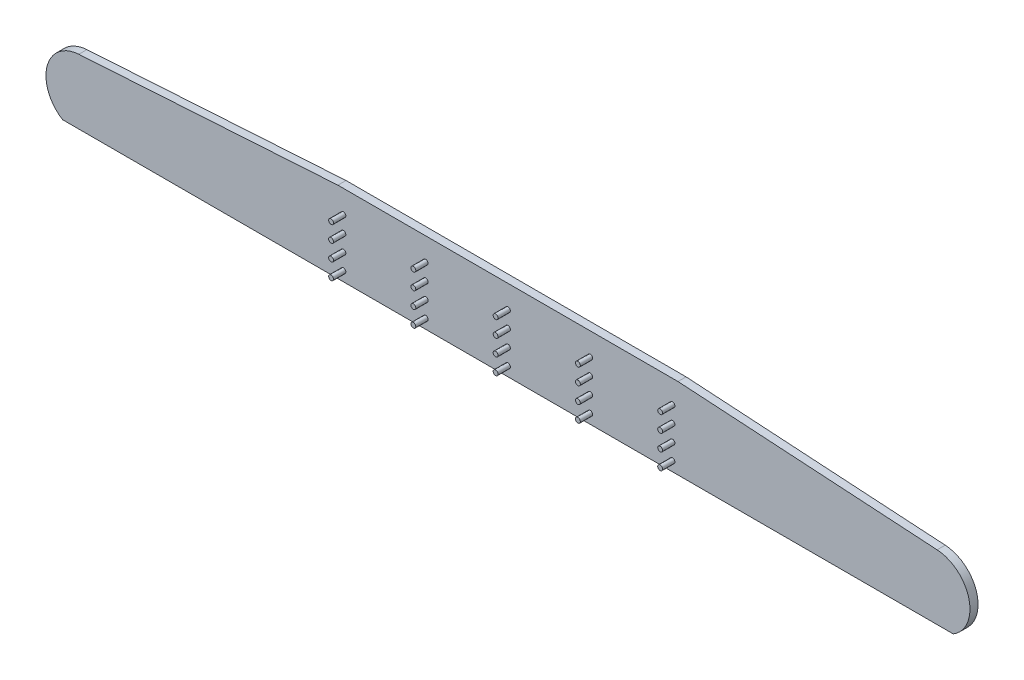
ISO-10303-21;
HEADER;
FILE_DESCRIPTION(('STEP AP214'),'2;1');
FILE_NAME('part.step','',(''),(''),'','','');
FILE_SCHEMA(('AUTOMOTIVE_DESIGN { 1 0 10303 214 1 1 1 1 }'));
ENDSEC;
DATA;
#1=APPLICATION_CONTEXT('core data for automotive mechanical design processes');
#2=APPLICATION_PROTOCOL_DEFINITION('international standard','automotive_design',2000,#1);
#3=PRODUCT_CONTEXT('',#1,'mechanical');
#4=PRODUCT('Part','Part','',(#3));
#5=PRODUCT_RELATED_PRODUCT_CATEGORY('part','',(#4));
#6=PRODUCT_DEFINITION_FORMATION('','',#4);
#7=PRODUCT_DEFINITION_CONTEXT('part definition',#1,'design');
#8=PRODUCT_DEFINITION('design','',#6,#7);
#9=PRODUCT_DEFINITION_SHAPE('','',#8);
#10=(LENGTH_UNIT() NAMED_UNIT(*) SI_UNIT(.MILLI.,.METRE.));
#11=(NAMED_UNIT(*) PLANE_ANGLE_UNIT() SI_UNIT($,.RADIAN.));
#12=(NAMED_UNIT(*) SI_UNIT($,.STERADIAN.) SOLID_ANGLE_UNIT());
#13=UNCERTAINTY_MEASURE_WITH_UNIT(LENGTH_MEASURE(1.E-05),#10,'distance_accuracy_value','');
#14=(GEOMETRIC_REPRESENTATION_CONTEXT(3) GLOBAL_UNCERTAINTY_ASSIGNED_CONTEXT((#13)) GLOBAL_UNIT_ASSIGNED_CONTEXT((#10,
#11,#12)) REPRESENTATION_CONTEXT('',''));
#15=CARTESIAN_POINT('',(0.,0.,0.));
#16=DIRECTION('',(0.,0.,1.));
#17=DIRECTION('',(1.,0.,0.));
#18=AXIS2_PLACEMENT_3D('',#15,#16,#17);
#19=CARTESIAN_POINT('',(0.,-25.,5.));
#20=DIRECTION('',(0.,-1.,0.));
#21=DIRECTION('',(0.,0.,-1.));
#22=AXIS2_PLACEMENT_3D('',#19,#20,#21);
#23=PLANE('',#22);
#24=DIRECTION('',(-1.,0.,0.));
#25=VECTOR('',#24,1.);
#26=CARTESIAN_POINT('',(0.,-25.,0.));
#27=LINE('',#26,#25);
#28=CARTESIAN_POINT('',(275.,-25.,0.));
#29=VERTEX_POINT('',#28);
#30=CARTESIAN_POINT('',(-275.,-25.,0.));
#31=VERTEX_POINT('',#30);
#32=EDGE_CURVE('E121',#29,#31,#27,.T.);
#33=ORIENTED_EDGE('',*,*,#32,.F.);
#34=DIRECTION('',(0.,0.,-1.));
#35=VECTOR('',#34,1.);
#36=CARTESIAN_POINT('',(275.,-25.,5.));
#37=LINE('',#36,#35);
#38=CARTESIAN_POINT('',(275.,-25.,5.));
#39=VERTEX_POINT('',#38);
#40=EDGE_CURVE('E11',#39,#29,#37,.T.);
#41=ORIENTED_EDGE('',*,*,#40,.F.);
#42=DIRECTION('',(-1.,0.,0.));
#43=VECTOR('',#42,1.);
#44=CARTESIAN_POINT('',(0.,-25.,5.));
#45=LINE('',#44,#43);
#46=CARTESIAN_POINT('',(-275.,-25.,5.));
#47=VERTEX_POINT('',#46);
#48=EDGE_CURVE('E135',#39,#47,#45,.T.);
#49=ORIENTED_EDGE('',*,*,#48,.T.);
#50=DIRECTION('',(0.,0.,-1.));
#51=VECTOR('',#50,1.);
#52=CARTESIAN_POINT('',(-275.,-25.,5.));
#53=LINE('',#52,#51);
#54=EDGE_CURVE('E83',#47,#31,#53,.T.);
#55=ORIENTED_EDGE('',*,*,#54,.T.);
#56=EDGE_LOOP('',(#33,#41,#49,#55));
#57=FACE_BOUND('',#56,.T.);
#58=ADVANCED_FACE('F39',(#57),#23,.T.);
#59=CARTESIAN_POINT('',(263.650793650794,-6.58730158730157,5.));
#60=DIRECTION('',(0.,0.,-1.));
#61=DIRECTION('',(-1.,0.,0.));
#62=AXIS2_PLACEMENT_3D('',#59,#60,#61);
#63=CYLINDRICAL_SURFACE('',#62,21.6294231914273);
#64=CARTESIAN_POINT('',(263.650793650794,-6.58730158730157,0.));
#65=DIRECTION('',(0.,0.,1.));
#66=DIRECTION('',(1.,0.,0.));
#67=AXIS2_PLACEMENT_3D('',#64,#65,#66);
#68=CIRCLE('',#67,21.6294231914273);
#69=CARTESIAN_POINT('',(265.,15.,0.));
#70=VERTEX_POINT('',#69);
#71=EDGE_CURVE('E124',#70,#29,#68,.F.);
#72=ORIENTED_EDGE('',*,*,#71,.F.);
#73=DIRECTION('',(0.,0.,-1.));
#74=VECTOR('',#73,1.);
#75=CARTESIAN_POINT('',(265.,15.,5.));
#76=LINE('',#75,#74);
#77=CARTESIAN_POINT('',(265.,15.,5.));
#78=VERTEX_POINT('',#77);
#79=EDGE_CURVE('E47',#78,#70,#76,.T.);
#80=ORIENTED_EDGE('',*,*,#79,.F.);
#81=CARTESIAN_POINT('',(263.650793650794,-6.58730158730157,5.));
#82=DIRECTION('',(0.,0.,1.));
#83=DIRECTION('',(1.,0.,0.));
#84=AXIS2_PLACEMENT_3D('',#81,#82,#83);
#85=CIRCLE('',#84,21.6294231914273);
#86=EDGE_CURVE('E116',#78,#39,#85,.F.);
#87=ORIENTED_EDGE('',*,*,#86,.T.);
#88=ORIENTED_EDGE('',*,*,#40,.T.);
#89=EDGE_LOOP('',(#72,#80,#87,#88));
#90=FACE_BOUND('',#89,.T.);
#91=ADVANCED_FACE('F144',(#90),#63,.T.);
#92=CARTESIAN_POINT('',(1.96498054474708,31.4396887159533,5.));
#93=DIRECTION('',(0.0623782861551805,0.998052578482888,0.));
#94=DIRECTION('',(-0.998052578482889,0.0623782861551805,0.));
#95=AXIS2_PLACEMENT_3D('',#92,#93,#94);
#96=PLANE('',#95);
#97=DIRECTION('',(0.998052578482889,-0.0623782861551805,0.));
#98=VECTOR('',#97,1.);
#99=CARTESIAN_POINT('',(1.96498054474708,31.4396887159533,0.));
#100=LINE('',#99,#98);
#101=CARTESIAN_POINT('',(105.,25.,0.));
#102=VERTEX_POINT('',#101);
#103=EDGE_CURVE('E128',#102,#70,#100,.T.);
#104=ORIENTED_EDGE('',*,*,#103,.F.);
#105=DIRECTION('',(0.,0.,-1.));
#106=VECTOR('',#105,1.);
#107=CARTESIAN_POINT('',(105.,25.,5.));
#108=LINE('',#107,#106);
#109=CARTESIAN_POINT('',(105.,25.,5.));
#110=VERTEX_POINT('',#109);
#111=EDGE_CURVE('E104',#110,#102,#108,.T.);
#112=ORIENTED_EDGE('',*,*,#111,.F.);
#113=DIRECTION('',(0.998052578482889,-0.0623782861551805,0.));
#114=VECTOR('',#113,1.);
#115=CARTESIAN_POINT('',(1.96498054474708,31.4396887159533,5.));
#116=LINE('',#115,#114);
#117=EDGE_CURVE('E114',#110,#78,#116,.T.);
#118=ORIENTED_EDGE('',*,*,#117,.T.);
#119=ORIENTED_EDGE('',*,*,#79,.T.);
#120=EDGE_LOOP('',(#104,#112,#118,#119));
#121=FACE_BOUND('',#120,.T.);
#122=ADVANCED_FACE('F141',(#121),#96,.T.);
#123=CARTESIAN_POINT('',(0.,25.,5.));
#124=DIRECTION('',(0.,1.,0.));
#125=DIRECTION('',(-1.,0.,0.));
#126=AXIS2_PLACEMENT_3D('',#123,#124,#125);
#127=PLANE('',#126);
#128=DIRECTION('',(1.,0.,0.));
#129=VECTOR('',#128,1.);
#130=CARTESIAN_POINT('',(0.,25.,0.));
#131=LINE('',#130,#129);
#132=CARTESIAN_POINT('',(-105.,25.,0.));
#133=VERTEX_POINT('',#132);
#134=EDGE_CURVE('E103',#133,#102,#131,.T.);
#135=ORIENTED_EDGE('',*,*,#134,.F.);
#136=DIRECTION('',(0.,0.,-1.));
#137=VECTOR('',#136,1.);
#138=CARTESIAN_POINT('',(-105.,25.,5.));
#139=LINE('',#138,#137);
#140=CARTESIAN_POINT('',(-105.,25.,5.));
#141=VERTEX_POINT('',#140);
#142=EDGE_CURVE('E97',#141,#133,#139,.T.);
#143=ORIENTED_EDGE('',*,*,#142,.F.);
#144=DIRECTION('',(1.,0.,0.));
#145=VECTOR('',#144,1.);
#146=CARTESIAN_POINT('',(0.,25.,5.));
#147=LINE('',#146,#145);
#148=EDGE_CURVE('E101',#141,#110,#147,.T.);
#149=ORIENTED_EDGE('',*,*,#148,.T.);
#150=ORIENTED_EDGE('',*,*,#111,.T.);
#151=EDGE_LOOP('',(#135,#143,#149,#150));
#152=FACE_BOUND('',#151,.T.);
#153=ADVANCED_FACE('F99',(#152),#127,.T.);
#154=CARTESIAN_POINT('',(-1.96498054474708,31.4396887159533,5.));
#155=DIRECTION('',(0.0623782861551805,-0.998052578482888,0.));
#156=DIRECTION('',(0.998052578482889,0.0623782861551805,0.));
#157=AXIS2_PLACEMENT_3D('',#154,#155,#156);
#158=PLANE('',#157);
#159=DIRECTION('',(-0.998052578482889,-0.0623782861551805,0.));
#160=VECTOR('',#159,1.);
#161=CARTESIAN_POINT('',(-1.96498054474708,31.4396887159533,0.));
#162=LINE('',#161,#160);
#163=CARTESIAN_POINT('',(-265.,15.,0.));
#164=VERTEX_POINT('',#163);
#165=EDGE_CURVE('E76',#133,#164,#162,.T.);
#166=ORIENTED_EDGE('',*,*,#165,.T.);
#167=DIRECTION('',(0.,0.,-1.));
#168=VECTOR('',#167,1.);
#169=CARTESIAN_POINT('',(-265.,15.,5.));
#170=LINE('',#169,#168);
#171=CARTESIAN_POINT('',(-265.,15.,5.));
#172=VERTEX_POINT('',#171);
#173=EDGE_CURVE('E105',#172,#164,#170,.T.);
#174=ORIENTED_EDGE('',*,*,#173,.F.);
#175=DIRECTION('',(-0.998052578482889,-0.0623782861551805,0.));
#176=VECTOR('',#175,1.);
#177=CARTESIAN_POINT('',(-1.96498054474708,31.4396887159533,5.));
#178=LINE('',#177,#176);
#179=EDGE_CURVE('E107',#141,#172,#178,.T.);
#180=ORIENTED_EDGE('',*,*,#179,.F.);
#181=ORIENTED_EDGE('',*,*,#142,.T.);
#182=EDGE_LOOP('',(#166,#174,#180,#181));
#183=FACE_BOUND('',#182,.T.);
#184=ADVANCED_FACE('F108',(#183),#158,.F.);
#185=CARTESIAN_POINT('',(-263.650793650794,-6.58730158730157,5.));
#186=DIRECTION('',(0.,0.,-1.));
#187=DIRECTION('',(-1.,0.,0.));
#188=AXIS2_PLACEMENT_3D('',#185,#186,#187);
#189=CYLINDRICAL_SURFACE('',#188,21.6294231914273);
#190=CARTESIAN_POINT('',(-263.650793650794,-6.58730158730157,0.));
#191=DIRECTION('',(0.,0.,1.));
#192=DIRECTION('',(1.,0.,0.));
#193=AXIS2_PLACEMENT_3D('',#190,#191,#192);
#194=CIRCLE('',#193,21.6294231914273);
#195=EDGE_CURVE('E133',#164,#31,#194,.T.);
#196=ORIENTED_EDGE('',*,*,#195,.T.);
#197=ORIENTED_EDGE('',*,*,#54,.F.);
#198=CARTESIAN_POINT('',(-263.650793650794,-6.58730158730157,5.));
#199=DIRECTION('',(0.,0.,1.));
#200=DIRECTION('',(1.,0.,0.));
#201=AXIS2_PLACEMENT_3D('',#198,#199,#200);
#202=CIRCLE('',#201,21.6294231914273);
#203=EDGE_CURVE('E55',#172,#47,#202,.T.);
#204=ORIENTED_EDGE('',*,*,#203,.F.);
#205=ORIENTED_EDGE('',*,*,#173,.T.);
#206=EDGE_LOOP('',(#196,#197,#204,#205));
#207=FACE_BOUND('',#206,.T.);
#208=ADVANCED_FACE('F149',(#207),#189,.T.);
#209=CARTESIAN_POINT('',(0.,0.,5.));
#210=DIRECTION('',(0.,0.,1.));
#211=DIRECTION('',(1.,0.,0.));
#212=AXIS2_PLACEMENT_3D('',#209,#210,#211);
#213=PLANE('',#212);
#214=CARTESIAN_POINT('',(101.6,-19.,5.));
#215=DIRECTION('',(0.,0.,1.));
#216=DIRECTION('',(1.,0.,0.));
#217=AXIS2_PLACEMENT_3D('',#214,#215,#216);
#218=CIRCLE('',#217,1.5);
#219=CARTESIAN_POINT('',(103.1,-19.,5.));
#220=VERTEX_POINT('',#219);
#221=EDGE_CURVE('E263',#220,#220,#218,.T.);
#222=ORIENTED_EDGE('',*,*,#221,.F.);
#223=EDGE_LOOP('',(#222));
#224=FACE_BOUND('',#223,.T.);
#225=CARTESIAN_POINT('',(101.6,-9.,5.));
#226=DIRECTION('',(0.,0.,1.));
#227=DIRECTION('',(1.,0.,0.));
#228=AXIS2_PLACEMENT_3D('',#225,#226,#227);
#229=CIRCLE('',#228,1.5);
#230=CARTESIAN_POINT('',(103.1,-9.,5.));
#231=VERTEX_POINT('',#230);
#232=EDGE_CURVE('E257',#231,#231,#229,.T.);
#233=ORIENTED_EDGE('',*,*,#232,.F.);
#234=EDGE_LOOP('',(#233));
#235=FACE_BOUND('',#234,.T.);
#236=CARTESIAN_POINT('',(101.6,0.999999999999999,5.));
#237=DIRECTION('',(0.,0.,1.));
#238=DIRECTION('',(1.,0.,0.));
#239=AXIS2_PLACEMENT_3D('',#236,#237,#238);
#240=CIRCLE('',#239,1.5);
#241=CARTESIAN_POINT('',(103.1,0.999999999999999,5.));
#242=VERTEX_POINT('',#241);
#243=EDGE_CURVE('E251',#242,#242,#240,.T.);
#244=ORIENTED_EDGE('',*,*,#243,.F.);
#245=EDGE_LOOP('',(#244));
#246=FACE_BOUND('',#245,.T.);
#247=CARTESIAN_POINT('',(101.6,11.,5.));
#248=DIRECTION('',(0.,0.,1.));
#249=DIRECTION('',(1.,0.,0.));
#250=AXIS2_PLACEMENT_3D('',#247,#248,#249);
#251=CIRCLE('',#250,1.5);
#252=CARTESIAN_POINT('',(103.1,11.,5.));
#253=VERTEX_POINT('',#252);
#254=EDGE_CURVE('E245',#253,#253,#251,.T.);
#255=ORIENTED_EDGE('',*,*,#254,.F.);
#256=EDGE_LOOP('',(#255));
#257=FACE_BOUND('',#256,.T.);
#258=CARTESIAN_POINT('',(50.8,11.,5.));
#259=DIRECTION('',(0.,0.,1.));
#260=DIRECTION('',(1.,0.,0.));
#261=AXIS2_PLACEMENT_3D('',#258,#259,#260);
#262=CIRCLE('',#261,1.5);
#263=CARTESIAN_POINT('',(52.3,11.,5.));
#264=VERTEX_POINT('',#263);
#265=EDGE_CURVE('E239',#264,#264,#262,.T.);
#266=ORIENTED_EDGE('',*,*,#265,.F.);
#267=EDGE_LOOP('',(#266));
#268=FACE_BOUND('',#267,.T.);
#269=CARTESIAN_POINT('',(50.8,0.999999999999999,5.));
#270=DIRECTION('',(0.,0.,1.));
#271=DIRECTION('',(1.,0.,0.));
#272=AXIS2_PLACEMENT_3D('',#269,#270,#271);
#273=CIRCLE('',#272,1.5);
#274=CARTESIAN_POINT('',(52.3,0.999999999999999,5.));
#275=VERTEX_POINT('',#274);
#276=EDGE_CURVE('E233',#275,#275,#273,.T.);
#277=ORIENTED_EDGE('',*,*,#276,.F.);
#278=EDGE_LOOP('',(#277));
#279=FACE_BOUND('',#278,.T.);
#280=CARTESIAN_POINT('',(50.8,-9.,5.));
#281=DIRECTION('',(0.,0.,1.));
#282=DIRECTION('',(1.,0.,0.));
#283=AXIS2_PLACEMENT_3D('',#280,#281,#282);
#284=CIRCLE('',#283,1.5);
#285=CARTESIAN_POINT('',(52.3,-9.,5.));
#286=VERTEX_POINT('',#285);
#287=EDGE_CURVE('E227',#286,#286,#284,.T.);
#288=ORIENTED_EDGE('',*,*,#287,.F.);
#289=EDGE_LOOP('',(#288));
#290=FACE_BOUND('',#289,.T.);
#291=CARTESIAN_POINT('',(50.8,-19.,5.));
#292=DIRECTION('',(0.,0.,1.));
#293=DIRECTION('',(1.,0.,0.));
#294=AXIS2_PLACEMENT_3D('',#291,#292,#293);
#295=CIRCLE('',#294,1.5);
#296=CARTESIAN_POINT('',(52.3,-19.,5.));
#297=VERTEX_POINT('',#296);
#298=EDGE_CURVE('E221',#297,#297,#295,.T.);
#299=ORIENTED_EDGE('',*,*,#298,.F.);
#300=EDGE_LOOP('',(#299));
#301=FACE_BOUND('',#300,.T.);
#302=CARTESIAN_POINT('',(0.,-19.,5.));
#303=DIRECTION('',(0.,0.,1.));
#304=DIRECTION('',(1.,0.,0.));
#305=AXIS2_PLACEMENT_3D('',#302,#303,#304);
#306=CIRCLE('',#305,1.5);
#307=CARTESIAN_POINT('',(1.5,-19.,5.));
#308=VERTEX_POINT('',#307);
#309=EDGE_CURVE('E215',#308,#308,#306,.T.);
#310=ORIENTED_EDGE('',*,*,#309,.F.);
#311=EDGE_LOOP('',(#310));
#312=FACE_BOUND('',#311,.T.);
#313=CARTESIAN_POINT('',(0.,-9.,5.));
#314=DIRECTION('',(0.,0.,1.));
#315=DIRECTION('',(1.,0.,0.));
#316=AXIS2_PLACEMENT_3D('',#313,#314,#315);
#317=CIRCLE('',#316,1.5);
#318=CARTESIAN_POINT('',(1.5,-9.,5.));
#319=VERTEX_POINT('',#318);
#320=EDGE_CURVE('E209',#319,#319,#317,.T.);
#321=ORIENTED_EDGE('',*,*,#320,.F.);
#322=EDGE_LOOP('',(#321));
#323=FACE_BOUND('',#322,.T.);
#324=CARTESIAN_POINT('',(0.,0.999999999999999,5.));
#325=DIRECTION('',(0.,0.,1.));
#326=DIRECTION('',(1.,0.,0.));
#327=AXIS2_PLACEMENT_3D('',#324,#325,#326);
#328=CIRCLE('',#327,1.5);
#329=CARTESIAN_POINT('',(1.5,0.999999999999999,5.));
#330=VERTEX_POINT('',#329);
#331=EDGE_CURVE('E203',#330,#330,#328,.T.);
#332=ORIENTED_EDGE('',*,*,#331,.F.);
#333=EDGE_LOOP('',(#332));
#334=FACE_BOUND('',#333,.T.);
#335=CARTESIAN_POINT('',(0.,11.,5.));
#336=DIRECTION('',(0.,0.,1.));
#337=DIRECTION('',(1.,0.,0.));
#338=AXIS2_PLACEMENT_3D('',#335,#336,#337);
#339=CIRCLE('',#338,1.5);
#340=CARTESIAN_POINT('',(1.5,11.,5.));
#341=VERTEX_POINT('',#340);
#342=EDGE_CURVE('E197',#341,#341,#339,.T.);
#343=ORIENTED_EDGE('',*,*,#342,.F.);
#344=EDGE_LOOP('',(#343));
#345=FACE_BOUND('',#344,.T.);
#346=CARTESIAN_POINT('',(-50.8,10.9999999999996,5.));
#347=DIRECTION('',(0.,0.,1.));
#348=DIRECTION('',(1.,0.,0.));
#349=AXIS2_PLACEMENT_3D('',#346,#347,#348);
#350=CIRCLE('',#349,1.5);
#351=CARTESIAN_POINT('',(-49.3,10.9999999999996,5.));
#352=VERTEX_POINT('',#351);
#353=EDGE_CURVE('E191',#352,#352,#350,.T.);
#354=ORIENTED_EDGE('',*,*,#353,.F.);
#355=EDGE_LOOP('',(#354));
#356=FACE_BOUND('',#355,.T.);
#357=CARTESIAN_POINT('',(-50.8,0.999999999999644,5.));
#358=DIRECTION('',(0.,0.,1.));
#359=DIRECTION('',(1.,0.,0.));
#360=AXIS2_PLACEMENT_3D('',#357,#358,#359);
#361=CIRCLE('',#360,1.5);
#362=CARTESIAN_POINT('',(-49.3,0.999999999999644,5.));
#363=VERTEX_POINT('',#362);
#364=EDGE_CURVE('E185',#363,#363,#361,.T.);
#365=ORIENTED_EDGE('',*,*,#364,.F.);
#366=EDGE_LOOP('',(#365));
#367=FACE_BOUND('',#366,.T.);
#368=CARTESIAN_POINT('',(-50.8,-9.00000000000036,5.));
#369=DIRECTION('',(0.,0.,1.));
#370=DIRECTION('',(1.,0.,0.));
#371=AXIS2_PLACEMENT_3D('',#368,#369,#370);
#372=CIRCLE('',#371,1.5);
#373=CARTESIAN_POINT('',(-49.3,-9.00000000000036,5.));
#374=VERTEX_POINT('',#373);
#375=EDGE_CURVE('E179',#374,#374,#372,.T.);
#376=ORIENTED_EDGE('',*,*,#375,.F.);
#377=EDGE_LOOP('',(#376));
#378=FACE_BOUND('',#377,.T.);
#379=CARTESIAN_POINT('',(-50.8,-19.0000000000004,5.));
#380=DIRECTION('',(0.,0.,1.));
#381=DIRECTION('',(1.,0.,0.));
#382=AXIS2_PLACEMENT_3D('',#379,#380,#381);
#383=CIRCLE('',#382,1.5);
#384=CARTESIAN_POINT('',(-49.3,-19.0000000000004,5.));
#385=VERTEX_POINT('',#384);
#386=EDGE_CURVE('E173',#385,#385,#383,.T.);
#387=ORIENTED_EDGE('',*,*,#386,.F.);
#388=EDGE_LOOP('',(#387));
#389=FACE_BOUND('',#388,.T.);
#390=CARTESIAN_POINT('',(-101.6,-19.0000000000007,5.));
#391=DIRECTION('',(0.,0.,1.));
#392=DIRECTION('',(1.,0.,0.));
#393=AXIS2_PLACEMENT_3D('',#390,#391,#392);
#394=CIRCLE('',#393,1.5);
#395=CARTESIAN_POINT('',(-100.1,-19.0000000000007,5.));
#396=VERTEX_POINT('',#395);
#397=EDGE_CURVE('E167',#396,#396,#394,.T.);
#398=ORIENTED_EDGE('',*,*,#397,.F.);
#399=EDGE_LOOP('',(#398));
#400=FACE_BOUND('',#399,.T.);
#401=CARTESIAN_POINT('',(-101.6,-9.00000000000071,5.));
#402=DIRECTION('',(0.,0.,1.));
#403=DIRECTION('',(1.,0.,0.));
#404=AXIS2_PLACEMENT_3D('',#401,#402,#403);
#405=CIRCLE('',#404,1.5);
#406=CARTESIAN_POINT('',(-100.1,-9.00000000000071,5.));
#407=VERTEX_POINT('',#406);
#408=EDGE_CURVE('E161',#407,#407,#405,.T.);
#409=ORIENTED_EDGE('',*,*,#408,.F.);
#410=EDGE_LOOP('',(#409));
#411=FACE_BOUND('',#410,.T.);
#412=CARTESIAN_POINT('',(-101.6,0.99999999999929,5.));
#413=DIRECTION('',(0.,0.,1.));
#414=DIRECTION('',(1.,0.,0.));
#415=AXIS2_PLACEMENT_3D('',#412,#413,#414);
#416=CIRCLE('',#415,1.5);
#417=CARTESIAN_POINT('',(-100.1,0.99999999999929,5.));
#418=VERTEX_POINT('',#417);
#419=EDGE_CURVE('E155',#418,#418,#416,.T.);
#420=ORIENTED_EDGE('',*,*,#419,.F.);
#421=EDGE_LOOP('',(#420));
#422=FACE_BOUND('',#421,.T.);
#423=CARTESIAN_POINT('',(-101.6,10.9999999999993,5.));
#424=DIRECTION('',(0.,0.,1.));
#425=DIRECTION('',(1.,0.,0.));
#426=AXIS2_PLACEMENT_3D('',#423,#424,#425);
#427=CIRCLE('',#426,1.5);
#428=CARTESIAN_POINT('',(-100.1,10.9999999999993,5.));
#429=VERTEX_POINT('',#428);
#430=EDGE_CURVE('E152',#429,#429,#427,.T.);
#431=ORIENTED_EDGE('',*,*,#430,.F.);
#432=EDGE_LOOP('',(#431));
#433=FACE_BOUND('',#432,.T.);
#434=ORIENTED_EDGE('',*,*,#48,.F.);
#435=ORIENTED_EDGE('',*,*,#86,.F.);
#436=ORIENTED_EDGE('',*,*,#117,.F.);
#437=ORIENTED_EDGE('',*,*,#148,.F.);
#438=ORIENTED_EDGE('',*,*,#179,.T.);
#439=ORIENTED_EDGE('',*,*,#203,.T.);
#440=EDGE_LOOP('',(#434,#435,#436,#437,#438,#439));
#441=FACE_BOUND('',#440,.T.);
#442=ADVANCED_FACE('F111',(#224,#235,#246,#257,#268,#279,#290,#301,#312,#323,#334,#345,#356,
#367,#378,#389,#400,#411,#422,#433,#441),#213,.T.);
#443=CARTESIAN_POINT('',(0.,0.,0.));
#444=DIRECTION('',(0.,0.,1.));
#445=DIRECTION('',(1.,0.,0.));
#446=AXIS2_PLACEMENT_3D('',#443,#444,#445);
#447=PLANE('',#446);
#448=ORIENTED_EDGE('',*,*,#32,.T.);
#449=ORIENTED_EDGE('',*,*,#195,.F.);
#450=ORIENTED_EDGE('',*,*,#165,.F.);
#451=ORIENTED_EDGE('',*,*,#134,.T.);
#452=ORIENTED_EDGE('',*,*,#103,.T.);
#453=ORIENTED_EDGE('',*,*,#71,.T.);
#454=EDGE_LOOP('',(#448,#449,#450,#451,#452,#453));
#455=FACE_BOUND('',#454,.T.);
#456=ADVANCED_FACE('F146',(#455),#447,.F.);
#457=CARTESIAN_POINT('',(-101.6,10.9999999999993,12.62));
#458=DIRECTION('',(0.,0.,-1.));
#459=DIRECTION('',(-1.,0.,0.));
#460=AXIS2_PLACEMENT_3D('',#457,#458,#459);
#461=CYLINDRICAL_SURFACE('',#460,1.5);
#462=CARTESIAN_POINT('',(-101.6,10.9999999999993,12.62));
#463=DIRECTION('',(0.,0.,1.));
#464=DIRECTION('',(1.,0.,0.));
#465=AXIS2_PLACEMENT_3D('',#462,#463,#464);
#466=CIRCLE('',#465,1.5);
#467=CARTESIAN_POINT('',(-100.1,10.9999999999993,12.62));
#468=VERTEX_POINT('',#467);
#469=EDGE_CURVE('E125',#468,#468,#466,.T.);
#470=ORIENTED_EDGE('',*,*,#469,.F.);
#471=EDGE_LOOP('',(#470));
#472=FACE_BOUND('',#471,.T.);
#473=ORIENTED_EDGE('',*,*,#430,.T.);
#474=EDGE_LOOP('',(#473));
#475=FACE_BOUND('',#474,.T.);
#476=ADVANCED_FACE('F315',(#472,#475),#461,.T.);
#477=CARTESIAN_POINT('',(-101.6,10.9999999999993,12.62));
#478=DIRECTION('',(0.,0.,1.));
#479=DIRECTION('',(1.,0.,0.));
#480=AXIS2_PLACEMENT_3D('',#477,#478,#479);
#481=PLANE('',#480);
#482=ORIENTED_EDGE('',*,*,#469,.T.);
#483=EDGE_LOOP('',(#482));
#484=FACE_BOUND('',#483,.T.);
#485=ADVANCED_FACE('F317',(#484),#481,.T.);
#486=CARTESIAN_POINT('',(-101.6,0.99999999999929,12.62));
#487=DIRECTION('',(0.,0.,-1.));
#488=DIRECTION('',(-1.,0.,0.));
#489=AXIS2_PLACEMENT_3D('',#486,#487,#488);
#490=CYLINDRICAL_SURFACE('',#489,1.5);
#491=CARTESIAN_POINT('',(-101.6,0.99999999999929,12.62));
#492=DIRECTION('',(0.,0.,1.));
#493=DIRECTION('',(1.,0.,0.));
#494=AXIS2_PLACEMENT_3D('',#491,#492,#493);
#495=CIRCLE('',#494,1.5);
#496=CARTESIAN_POINT('',(-100.1,0.99999999999929,12.62));
#497=VERTEX_POINT('',#496);
#498=EDGE_CURVE('E158',#497,#497,#495,.T.);
#499=ORIENTED_EDGE('',*,*,#498,.F.);
#500=EDGE_LOOP('',(#499));
#501=FACE_BOUND('',#500,.T.);
#502=ORIENTED_EDGE('',*,*,#419,.T.);
#503=EDGE_LOOP('',(#502));
#504=FACE_BOUND('',#503,.T.);
#505=ADVANCED_FACE('F324',(#501,#504),#490,.T.);
#506=CARTESIAN_POINT('',(-101.6,0.99999999999929,12.62));
#507=DIRECTION('',(0.,0.,1.));
#508=DIRECTION('',(1.,0.,0.));
#509=AXIS2_PLACEMENT_3D('',#506,#507,#508);
#510=PLANE('',#509);
#511=ORIENTED_EDGE('',*,*,#498,.T.);
#512=EDGE_LOOP('',(#511));
#513=FACE_BOUND('',#512,.T.);
#514=ADVANCED_FACE('F378',(#513),#510,.T.);
#515=CARTESIAN_POINT('',(-101.6,-9.00000000000071,12.62));
#516=DIRECTION('',(0.,0.,-1.));
#517=DIRECTION('',(-1.,0.,0.));
#518=AXIS2_PLACEMENT_3D('',#515,#516,#517);
#519=CYLINDRICAL_SURFACE('',#518,1.5);
#520=CARTESIAN_POINT('',(-101.6,-9.00000000000071,12.62));
#521=DIRECTION('',(0.,0.,1.));
#522=DIRECTION('',(1.,0.,0.));
#523=AXIS2_PLACEMENT_3D('',#520,#521,#522);
#524=CIRCLE('',#523,1.5);
#525=CARTESIAN_POINT('',(-100.1,-9.00000000000071,12.62));
#526=VERTEX_POINT('',#525);
#527=EDGE_CURVE('E164',#526,#526,#524,.T.);
#528=ORIENTED_EDGE('',*,*,#527,.F.);
#529=EDGE_LOOP('',(#528));
#530=FACE_BOUND('',#529,.T.);
#531=ORIENTED_EDGE('',*,*,#408,.T.);
#532=EDGE_LOOP('',(#531));
#533=FACE_BOUND('',#532,.T.);
#534=ADVANCED_FACE('F387',(#530,#533),#519,.T.);
#535=CARTESIAN_POINT('',(-101.6,-9.00000000000071,12.62));
#536=DIRECTION('',(0.,0.,1.));
#537=DIRECTION('',(1.,0.,0.));
#538=AXIS2_PLACEMENT_3D('',#535,#536,#537);
#539=PLANE('',#538);
#540=ORIENTED_EDGE('',*,*,#527,.T.);
#541=EDGE_LOOP('',(#540));
#542=FACE_BOUND('',#541,.T.);
#543=ADVANCED_FACE('F396',(#542),#539,.T.);
#544=CARTESIAN_POINT('',(-101.6,-19.0000000000007,12.62));
#545=DIRECTION('',(0.,0.,-1.));
#546=DIRECTION('',(-1.,0.,0.));
#547=AXIS2_PLACEMENT_3D('',#544,#545,#546);
#548=CYLINDRICAL_SURFACE('',#547,1.5);
#549=CARTESIAN_POINT('',(-101.6,-19.0000000000007,12.62));
#550=DIRECTION('',(0.,0.,1.));
#551=DIRECTION('',(1.,0.,0.));
#552=AXIS2_PLACEMENT_3D('',#549,#550,#551);
#553=CIRCLE('',#552,1.5);
#554=CARTESIAN_POINT('',(-100.1,-19.0000000000007,12.62));
#555=VERTEX_POINT('',#554);
#556=EDGE_CURVE('E170',#555,#555,#553,.T.);
#557=ORIENTED_EDGE('',*,*,#556,.F.);
#558=EDGE_LOOP('',(#557));
#559=FACE_BOUND('',#558,.T.);
#560=ORIENTED_EDGE('',*,*,#397,.T.);
#561=EDGE_LOOP('',(#560));
#562=FACE_BOUND('',#561,.T.);
#563=ADVANCED_FACE('F405',(#559,#562),#548,.T.);
#564=CARTESIAN_POINT('',(-101.6,-19.0000000000007,12.62));
#565=DIRECTION('',(0.,0.,1.));
#566=DIRECTION('',(1.,0.,0.));
#567=AXIS2_PLACEMENT_3D('',#564,#565,#566);
#568=PLANE('',#567);
#569=ORIENTED_EDGE('',*,*,#556,.T.);
#570=EDGE_LOOP('',(#569));
#571=FACE_BOUND('',#570,.T.);
#572=ADVANCED_FACE('F414',(#571),#568,.T.);
#573=CARTESIAN_POINT('',(-50.8,-19.0000000000004,12.62));
#574=DIRECTION('',(0.,0.,-1.));
#575=DIRECTION('',(-1.,0.,0.));
#576=AXIS2_PLACEMENT_3D('',#573,#574,#575);
#577=CYLINDRICAL_SURFACE('',#576,1.5);
#578=CARTESIAN_POINT('',(-50.8,-19.0000000000004,12.62));
#579=DIRECTION('',(0.,0.,1.));
#580=DIRECTION('',(1.,0.,0.));
#581=AXIS2_PLACEMENT_3D('',#578,#579,#580);
#582=CIRCLE('',#581,1.5);
#583=CARTESIAN_POINT('',(-49.3,-19.0000000000004,12.62));
#584=VERTEX_POINT('',#583);
#585=EDGE_CURVE('E176',#584,#584,#582,.T.);
#586=ORIENTED_EDGE('',*,*,#585,.F.);
#587=EDGE_LOOP('',(#586));
#588=FACE_BOUND('',#587,.T.);
#589=ORIENTED_EDGE('',*,*,#386,.T.);
#590=EDGE_LOOP('',(#589));
#591=FACE_BOUND('',#590,.T.);
#592=ADVANCED_FACE('F423',(#588,#591),#577,.T.);
#593=CARTESIAN_POINT('',(-50.8,-19.0000000000004,12.62));
#594=DIRECTION('',(0.,0.,1.));
#595=DIRECTION('',(1.,0.,0.));
#596=AXIS2_PLACEMENT_3D('',#593,#594,#595);
#597=PLANE('',#596);
#598=ORIENTED_EDGE('',*,*,#585,.T.);
#599=EDGE_LOOP('',(#598));
#600=FACE_BOUND('',#599,.T.);
#601=ADVANCED_FACE('F432',(#600),#597,.T.);
#602=CARTESIAN_POINT('',(-50.8,-9.00000000000036,12.62));
#603=DIRECTION('',(0.,0.,-1.));
#604=DIRECTION('',(-1.,0.,0.));
#605=AXIS2_PLACEMENT_3D('',#602,#603,#604);
#606=CYLINDRICAL_SURFACE('',#605,1.5);
#607=CARTESIAN_POINT('',(-50.8,-9.00000000000036,12.62));
#608=DIRECTION('',(0.,0.,1.));
#609=DIRECTION('',(1.,0.,0.));
#610=AXIS2_PLACEMENT_3D('',#607,#608,#609);
#611=CIRCLE('',#610,1.5);
#612=CARTESIAN_POINT('',(-49.3,-9.00000000000036,12.62));
#613=VERTEX_POINT('',#612);
#614=EDGE_CURVE('E182',#613,#613,#611,.T.);
#615=ORIENTED_EDGE('',*,*,#614,.F.);
#616=EDGE_LOOP('',(#615));
#617=FACE_BOUND('',#616,.T.);
#618=ORIENTED_EDGE('',*,*,#375,.T.);
#619=EDGE_LOOP('',(#618));
#620=FACE_BOUND('',#619,.T.);
#621=ADVANCED_FACE('F441',(#617,#620),#606,.T.);
#622=CARTESIAN_POINT('',(-50.8,-9.00000000000036,12.62));
#623=DIRECTION('',(0.,0.,1.));
#624=DIRECTION('',(1.,0.,0.));
#625=AXIS2_PLACEMENT_3D('',#622,#623,#624);
#626=PLANE('',#625);
#627=ORIENTED_EDGE('',*,*,#614,.T.);
#628=EDGE_LOOP('',(#627));
#629=FACE_BOUND('',#628,.T.);
#630=ADVANCED_FACE('F450',(#629),#626,.T.);
#631=CARTESIAN_POINT('',(-50.8,0.999999999999644,12.62));
#632=DIRECTION('',(0.,0.,-1.));
#633=DIRECTION('',(-1.,0.,0.));
#634=AXIS2_PLACEMENT_3D('',#631,#632,#633);
#635=CYLINDRICAL_SURFACE('',#634,1.5);
#636=CARTESIAN_POINT('',(-50.8,0.999999999999644,12.62));
#637=DIRECTION('',(0.,0.,1.));
#638=DIRECTION('',(1.,0.,0.));
#639=AXIS2_PLACEMENT_3D('',#636,#637,#638);
#640=CIRCLE('',#639,1.5);
#641=CARTESIAN_POINT('',(-49.3,0.999999999999644,12.62));
#642=VERTEX_POINT('',#641);
#643=EDGE_CURVE('E188',#642,#642,#640,.T.);
#644=ORIENTED_EDGE('',*,*,#643,.F.);
#645=EDGE_LOOP('',(#644));
#646=FACE_BOUND('',#645,.T.);
#647=ORIENTED_EDGE('',*,*,#364,.T.);
#648=EDGE_LOOP('',(#647));
#649=FACE_BOUND('',#648,.T.);
#650=ADVANCED_FACE('F459',(#646,#649),#635,.T.);
#651=CARTESIAN_POINT('',(-50.8,0.999999999999644,12.62));
#652=DIRECTION('',(0.,0.,1.));
#653=DIRECTION('',(1.,0.,0.));
#654=AXIS2_PLACEMENT_3D('',#651,#652,#653);
#655=PLANE('',#654);
#656=ORIENTED_EDGE('',*,*,#643,.T.);
#657=EDGE_LOOP('',(#656));
#658=FACE_BOUND('',#657,.T.);
#659=ADVANCED_FACE('F468',(#658),#655,.T.);
#660=CARTESIAN_POINT('',(-50.8,10.9999999999996,12.62));
#661=DIRECTION('',(0.,0.,-1.));
#662=DIRECTION('',(-1.,0.,0.));
#663=AXIS2_PLACEMENT_3D('',#660,#661,#662);
#664=CYLINDRICAL_SURFACE('',#663,1.5);
#665=CARTESIAN_POINT('',(-50.8,10.9999999999996,12.62));
#666=DIRECTION('',(0.,0.,1.));
#667=DIRECTION('',(1.,0.,0.));
#668=AXIS2_PLACEMENT_3D('',#665,#666,#667);
#669=CIRCLE('',#668,1.5);
#670=CARTESIAN_POINT('',(-49.3,10.9999999999996,12.62));
#671=VERTEX_POINT('',#670);
#672=EDGE_CURVE('E194',#671,#671,#669,.T.);
#673=ORIENTED_EDGE('',*,*,#672,.F.);
#674=EDGE_LOOP('',(#673));
#675=FACE_BOUND('',#674,.T.);
#676=ORIENTED_EDGE('',*,*,#353,.T.);
#677=EDGE_LOOP('',(#676));
#678=FACE_BOUND('',#677,.T.);
#679=ADVANCED_FACE('F477',(#675,#678),#664,.T.);
#680=CARTESIAN_POINT('',(-50.8,10.9999999999996,12.62));
#681=DIRECTION('',(0.,0.,1.));
#682=DIRECTION('',(1.,0.,0.));
#683=AXIS2_PLACEMENT_3D('',#680,#681,#682);
#684=PLANE('',#683);
#685=ORIENTED_EDGE('',*,*,#672,.T.);
#686=EDGE_LOOP('',(#685));
#687=FACE_BOUND('',#686,.T.);
#688=ADVANCED_FACE('F486',(#687),#684,.T.);
#689=CARTESIAN_POINT('',(0.,11.,12.62));
#690=DIRECTION('',(0.,0.,-1.));
#691=DIRECTION('',(-1.,0.,0.));
#692=AXIS2_PLACEMENT_3D('',#689,#690,#691);
#693=CYLINDRICAL_SURFACE('',#692,1.5);
#694=CARTESIAN_POINT('',(0.,11.,12.62));
#695=DIRECTION('',(0.,0.,1.));
#696=DIRECTION('',(1.,0.,0.));
#697=AXIS2_PLACEMENT_3D('',#694,#695,#696);
#698=CIRCLE('',#697,1.5);
#699=CARTESIAN_POINT('',(1.5,11.,12.62));
#700=VERTEX_POINT('',#699);
#701=EDGE_CURVE('E200',#700,#700,#698,.T.);
#702=ORIENTED_EDGE('',*,*,#701,.F.);
#703=EDGE_LOOP('',(#702));
#704=FACE_BOUND('',#703,.T.);
#705=ORIENTED_EDGE('',*,*,#342,.T.);
#706=EDGE_LOOP('',(#705));
#707=FACE_BOUND('',#706,.T.);
#708=ADVANCED_FACE('F495',(#704,#707),#693,.T.);
#709=CARTESIAN_POINT('',(0.,11.,12.62));
#710=DIRECTION('',(0.,0.,1.));
#711=DIRECTION('',(1.,0.,0.));
#712=AXIS2_PLACEMENT_3D('',#709,#710,#711);
#713=PLANE('',#712);
#714=ORIENTED_EDGE('',*,*,#701,.T.);
#715=EDGE_LOOP('',(#714));
#716=FACE_BOUND('',#715,.T.);
#717=ADVANCED_FACE('F504',(#716),#713,.T.);
#718=CARTESIAN_POINT('',(0.,0.999999999999999,12.62));
#719=DIRECTION('',(0.,0.,-1.));
#720=DIRECTION('',(-1.,0.,0.));
#721=AXIS2_PLACEMENT_3D('',#718,#719,#720);
#722=CYLINDRICAL_SURFACE('',#721,1.5);
#723=CARTESIAN_POINT('',(0.,0.999999999999999,12.62));
#724=DIRECTION('',(0.,0.,1.));
#725=DIRECTION('',(1.,0.,0.));
#726=AXIS2_PLACEMENT_3D('',#723,#724,#725);
#727=CIRCLE('',#726,1.5);
#728=CARTESIAN_POINT('',(1.5,0.999999999999999,12.62));
#729=VERTEX_POINT('',#728);
#730=EDGE_CURVE('E206',#729,#729,#727,.T.);
#731=ORIENTED_EDGE('',*,*,#730,.F.);
#732=EDGE_LOOP('',(#731));
#733=FACE_BOUND('',#732,.T.);
#734=ORIENTED_EDGE('',*,*,#331,.T.);
#735=EDGE_LOOP('',(#734));
#736=FACE_BOUND('',#735,.T.);
#737=ADVANCED_FACE('F513',(#733,#736),#722,.T.);
#738=CARTESIAN_POINT('',(0.,0.999999999999999,12.62));
#739=DIRECTION('',(0.,0.,1.));
#740=DIRECTION('',(1.,0.,0.));
#741=AXIS2_PLACEMENT_3D('',#738,#739,#740);
#742=PLANE('',#741);
#743=ORIENTED_EDGE('',*,*,#730,.T.);
#744=EDGE_LOOP('',(#743));
#745=FACE_BOUND('',#744,.T.);
#746=ADVANCED_FACE('F522',(#745),#742,.T.);
#747=CARTESIAN_POINT('',(0.,-9.,12.62));
#748=DIRECTION('',(0.,0.,-1.));
#749=DIRECTION('',(-1.,0.,0.));
#750=AXIS2_PLACEMENT_3D('',#747,#748,#749);
#751=CYLINDRICAL_SURFACE('',#750,1.5);
#752=CARTESIAN_POINT('',(0.,-9.,12.62));
#753=DIRECTION('',(0.,0.,1.));
#754=DIRECTION('',(1.,0.,0.));
#755=AXIS2_PLACEMENT_3D('',#752,#753,#754);
#756=CIRCLE('',#755,1.5);
#757=CARTESIAN_POINT('',(1.5,-9.,12.62));
#758=VERTEX_POINT('',#757);
#759=EDGE_CURVE('E212',#758,#758,#756,.T.);
#760=ORIENTED_EDGE('',*,*,#759,.F.);
#761=EDGE_LOOP('',(#760));
#762=FACE_BOUND('',#761,.T.);
#763=ORIENTED_EDGE('',*,*,#320,.T.);
#764=EDGE_LOOP('',(#763));
#765=FACE_BOUND('',#764,.T.);
#766=ADVANCED_FACE('F531',(#762,#765),#751,.T.);
#767=CARTESIAN_POINT('',(0.,-9.,12.62));
#768=DIRECTION('',(0.,0.,1.));
#769=DIRECTION('',(1.,0.,0.));
#770=AXIS2_PLACEMENT_3D('',#767,#768,#769);
#771=PLANE('',#770);
#772=ORIENTED_EDGE('',*,*,#759,.T.);
#773=EDGE_LOOP('',(#772));
#774=FACE_BOUND('',#773,.T.);
#775=ADVANCED_FACE('F540',(#774),#771,.T.);
#776=CARTESIAN_POINT('',(0.,-19.,12.62));
#777=DIRECTION('',(0.,0.,-1.));
#778=DIRECTION('',(-1.,0.,0.));
#779=AXIS2_PLACEMENT_3D('',#776,#777,#778);
#780=CYLINDRICAL_SURFACE('',#779,1.5);
#781=CARTESIAN_POINT('',(0.,-19.,12.62));
#782=DIRECTION('',(0.,0.,1.));
#783=DIRECTION('',(1.,0.,0.));
#784=AXIS2_PLACEMENT_3D('',#781,#782,#783);
#785=CIRCLE('',#784,1.5);
#786=CARTESIAN_POINT('',(1.5,-19.,12.62));
#787=VERTEX_POINT('',#786);
#788=EDGE_CURVE('E218',#787,#787,#785,.T.);
#789=ORIENTED_EDGE('',*,*,#788,.F.);
#790=EDGE_LOOP('',(#789));
#791=FACE_BOUND('',#790,.T.);
#792=ORIENTED_EDGE('',*,*,#309,.T.);
#793=EDGE_LOOP('',(#792));
#794=FACE_BOUND('',#793,.T.);
#795=ADVANCED_FACE('F549',(#791,#794),#780,.T.);
#796=CARTESIAN_POINT('',(0.,-19.,12.62));
#797=DIRECTION('',(0.,0.,1.));
#798=DIRECTION('',(1.,0.,0.));
#799=AXIS2_PLACEMENT_3D('',#796,#797,#798);
#800=PLANE('',#799);
#801=ORIENTED_EDGE('',*,*,#788,.T.);
#802=EDGE_LOOP('',(#801));
#803=FACE_BOUND('',#802,.T.);
#804=ADVANCED_FACE('F558',(#803),#800,.T.);
#805=CARTESIAN_POINT('',(50.8,-19.,12.62));
#806=DIRECTION('',(0.,0.,-1.));
#807=DIRECTION('',(-1.,0.,0.));
#808=AXIS2_PLACEMENT_3D('',#805,#806,#807);
#809=CYLINDRICAL_SURFACE('',#808,1.5);
#810=CARTESIAN_POINT('',(50.8,-19.,12.62));
#811=DIRECTION('',(0.,0.,1.));
#812=DIRECTION('',(1.,0.,0.));
#813=AXIS2_PLACEMENT_3D('',#810,#811,#812);
#814=CIRCLE('',#813,1.5);
#815=CARTESIAN_POINT('',(52.3,-19.,12.62));
#816=VERTEX_POINT('',#815);
#817=EDGE_CURVE('E224',#816,#816,#814,.T.);
#818=ORIENTED_EDGE('',*,*,#817,.F.);
#819=EDGE_LOOP('',(#818));
#820=FACE_BOUND('',#819,.T.);
#821=ORIENTED_EDGE('',*,*,#298,.T.);
#822=EDGE_LOOP('',(#821));
#823=FACE_BOUND('',#822,.T.);
#824=ADVANCED_FACE('F567',(#820,#823),#809,.T.);
#825=CARTESIAN_POINT('',(50.8,-19.,12.62));
#826=DIRECTION('',(0.,0.,1.));
#827=DIRECTION('',(1.,0.,0.));
#828=AXIS2_PLACEMENT_3D('',#825,#826,#827);
#829=PLANE('',#828);
#830=ORIENTED_EDGE('',*,*,#817,.T.);
#831=EDGE_LOOP('',(#830));
#832=FACE_BOUND('',#831,.T.);
#833=ADVANCED_FACE('F576',(#832),#829,.T.);
#834=CARTESIAN_POINT('',(50.8,-9.,12.62));
#835=DIRECTION('',(0.,0.,-1.));
#836=DIRECTION('',(-1.,0.,0.));
#837=AXIS2_PLACEMENT_3D('',#834,#835,#836);
#838=CYLINDRICAL_SURFACE('',#837,1.5);
#839=CARTESIAN_POINT('',(50.8,-9.,12.62));
#840=DIRECTION('',(0.,0.,1.));
#841=DIRECTION('',(1.,0.,0.));
#842=AXIS2_PLACEMENT_3D('',#839,#840,#841);
#843=CIRCLE('',#842,1.5);
#844=CARTESIAN_POINT('',(52.3,-9.,12.62));
#845=VERTEX_POINT('',#844);
#846=EDGE_CURVE('E230',#845,#845,#843,.T.);
#847=ORIENTED_EDGE('',*,*,#846,.F.);
#848=EDGE_LOOP('',(#847));
#849=FACE_BOUND('',#848,.T.);
#850=ORIENTED_EDGE('',*,*,#287,.T.);
#851=EDGE_LOOP('',(#850));
#852=FACE_BOUND('',#851,.T.);
#853=ADVANCED_FACE('F585',(#849,#852),#838,.T.);
#854=CARTESIAN_POINT('',(50.8,-9.,12.62));
#855=DIRECTION('',(0.,0.,1.));
#856=DIRECTION('',(1.,0.,0.));
#857=AXIS2_PLACEMENT_3D('',#854,#855,#856);
#858=PLANE('',#857);
#859=ORIENTED_EDGE('',*,*,#846,.T.);
#860=EDGE_LOOP('',(#859));
#861=FACE_BOUND('',#860,.T.);
#862=ADVANCED_FACE('F594',(#861),#858,.T.);
#863=CARTESIAN_POINT('',(50.8,0.999999999999999,12.62));
#864=DIRECTION('',(0.,0.,-1.));
#865=DIRECTION('',(-1.,0.,0.));
#866=AXIS2_PLACEMENT_3D('',#863,#864,#865);
#867=CYLINDRICAL_SURFACE('',#866,1.5);
#868=CARTESIAN_POINT('',(50.8,0.999999999999999,12.62));
#869=DIRECTION('',(0.,0.,1.));
#870=DIRECTION('',(1.,0.,0.));
#871=AXIS2_PLACEMENT_3D('',#868,#869,#870);
#872=CIRCLE('',#871,1.5);
#873=CARTESIAN_POINT('',(52.3,0.999999999999999,12.62));
#874=VERTEX_POINT('',#873);
#875=EDGE_CURVE('E236',#874,#874,#872,.T.);
#876=ORIENTED_EDGE('',*,*,#875,.F.);
#877=EDGE_LOOP('',(#876));
#878=FACE_BOUND('',#877,.T.);
#879=ORIENTED_EDGE('',*,*,#276,.T.);
#880=EDGE_LOOP('',(#879));
#881=FACE_BOUND('',#880,.T.);
#882=ADVANCED_FACE('F603',(#878,#881),#867,.T.);
#883=CARTESIAN_POINT('',(50.8,0.999999999999999,12.62));
#884=DIRECTION('',(0.,0.,1.));
#885=DIRECTION('',(1.,0.,0.));
#886=AXIS2_PLACEMENT_3D('',#883,#884,#885);
#887=PLANE('',#886);
#888=ORIENTED_EDGE('',*,*,#875,.T.);
#889=EDGE_LOOP('',(#888));
#890=FACE_BOUND('',#889,.T.);
#891=ADVANCED_FACE('F612',(#890),#887,.T.);
#892=CARTESIAN_POINT('',(50.8,11.,12.62));
#893=DIRECTION('',(0.,0.,-1.));
#894=DIRECTION('',(-1.,0.,0.));
#895=AXIS2_PLACEMENT_3D('',#892,#893,#894);
#896=CYLINDRICAL_SURFACE('',#895,1.5);
#897=CARTESIAN_POINT('',(50.8,11.,12.62));
#898=DIRECTION('',(0.,0.,1.));
#899=DIRECTION('',(1.,0.,0.));
#900=AXIS2_PLACEMENT_3D('',#897,#898,#899);
#901=CIRCLE('',#900,1.5);
#902=CARTESIAN_POINT('',(52.3,11.,12.62));
#903=VERTEX_POINT('',#902);
#904=EDGE_CURVE('E242',#903,#903,#901,.T.);
#905=ORIENTED_EDGE('',*,*,#904,.F.);
#906=EDGE_LOOP('',(#905));
#907=FACE_BOUND('',#906,.T.);
#908=ORIENTED_EDGE('',*,*,#265,.T.);
#909=EDGE_LOOP('',(#908));
#910=FACE_BOUND('',#909,.T.);
#911=ADVANCED_FACE('F621',(#907,#910),#896,.T.);
#912=CARTESIAN_POINT('',(50.8,11.,12.62));
#913=DIRECTION('',(0.,0.,1.));
#914=DIRECTION('',(1.,0.,0.));
#915=AXIS2_PLACEMENT_3D('',#912,#913,#914);
#916=PLANE('',#915);
#917=ORIENTED_EDGE('',*,*,#904,.T.);
#918=EDGE_LOOP('',(#917));
#919=FACE_BOUND('',#918,.T.);
#920=ADVANCED_FACE('F630',(#919),#916,.T.);
#921=CARTESIAN_POINT('',(101.6,11.,12.62));
#922=DIRECTION('',(0.,0.,-1.));
#923=DIRECTION('',(-1.,0.,0.));
#924=AXIS2_PLACEMENT_3D('',#921,#922,#923);
#925=CYLINDRICAL_SURFACE('',#924,1.5);
#926=CARTESIAN_POINT('',(101.6,11.,12.62));
#927=DIRECTION('',(0.,0.,1.));
#928=DIRECTION('',(1.,0.,0.));
#929=AXIS2_PLACEMENT_3D('',#926,#927,#928);
#930=CIRCLE('',#929,1.5);
#931=CARTESIAN_POINT('',(103.1,11.,12.62));
#932=VERTEX_POINT('',#931);
#933=EDGE_CURVE('E248',#932,#932,#930,.T.);
#934=ORIENTED_EDGE('',*,*,#933,.F.);
#935=EDGE_LOOP('',(#934));
#936=FACE_BOUND('',#935,.T.);
#937=ORIENTED_EDGE('',*,*,#254,.T.);
#938=EDGE_LOOP('',(#937));
#939=FACE_BOUND('',#938,.T.);
#940=ADVANCED_FACE('F639',(#936,#939),#925,.T.);
#941=CARTESIAN_POINT('',(101.6,11.,12.62));
#942=DIRECTION('',(0.,0.,1.));
#943=DIRECTION('',(1.,0.,0.));
#944=AXIS2_PLACEMENT_3D('',#941,#942,#943);
#945=PLANE('',#944);
#946=ORIENTED_EDGE('',*,*,#933,.T.);
#947=EDGE_LOOP('',(#946));
#948=FACE_BOUND('',#947,.T.);
#949=ADVANCED_FACE('F648',(#948),#945,.T.);
#950=CARTESIAN_POINT('',(101.6,0.999999999999999,12.62));
#951=DIRECTION('',(0.,0.,-1.));
#952=DIRECTION('',(-1.,0.,0.));
#953=AXIS2_PLACEMENT_3D('',#950,#951,#952);
#954=CYLINDRICAL_SURFACE('',#953,1.5);
#955=CARTESIAN_POINT('',(101.6,0.999999999999999,12.62));
#956=DIRECTION('',(0.,0.,1.));
#957=DIRECTION('',(1.,0.,0.));
#958=AXIS2_PLACEMENT_3D('',#955,#956,#957);
#959=CIRCLE('',#958,1.5);
#960=CARTESIAN_POINT('',(103.1,0.999999999999999,12.62));
#961=VERTEX_POINT('',#960);
#962=EDGE_CURVE('E254',#961,#961,#959,.T.);
#963=ORIENTED_EDGE('',*,*,#962,.F.);
#964=EDGE_LOOP('',(#963));
#965=FACE_BOUND('',#964,.T.);
#966=ORIENTED_EDGE('',*,*,#243,.T.);
#967=EDGE_LOOP('',(#966));
#968=FACE_BOUND('',#967,.T.);
#969=ADVANCED_FACE('F657',(#965,#968),#954,.T.);
#970=CARTESIAN_POINT('',(101.6,0.999999999999999,12.62));
#971=DIRECTION('',(0.,0.,1.));
#972=DIRECTION('',(1.,0.,0.));
#973=AXIS2_PLACEMENT_3D('',#970,#971,#972);
#974=PLANE('',#973);
#975=ORIENTED_EDGE('',*,*,#962,.T.);
#976=EDGE_LOOP('',(#975));
#977=FACE_BOUND('',#976,.T.);
#978=ADVANCED_FACE('F666',(#977),#974,.T.);
#979=CARTESIAN_POINT('',(101.6,-9.,12.62));
#980=DIRECTION('',(0.,0.,-1.));
#981=DIRECTION('',(-1.,0.,0.));
#982=AXIS2_PLACEMENT_3D('',#979,#980,#981);
#983=CYLINDRICAL_SURFACE('',#982,1.5);
#984=CARTESIAN_POINT('',(101.6,-9.,12.62));
#985=DIRECTION('',(0.,0.,1.));
#986=DIRECTION('',(1.,0.,0.));
#987=AXIS2_PLACEMENT_3D('',#984,#985,#986);
#988=CIRCLE('',#987,1.5);
#989=CARTESIAN_POINT('',(103.1,-9.,12.62));
#990=VERTEX_POINT('',#989);
#991=EDGE_CURVE('E260',#990,#990,#988,.T.);
#992=ORIENTED_EDGE('',*,*,#991,.F.);
#993=EDGE_LOOP('',(#992));
#994=FACE_BOUND('',#993,.T.);
#995=ORIENTED_EDGE('',*,*,#232,.T.);
#996=EDGE_LOOP('',(#995));
#997=FACE_BOUND('',#996,.T.);
#998=ADVANCED_FACE('F675',(#994,#997),#983,.T.);
#999=CARTESIAN_POINT('',(101.6,-9.,12.62));
#1000=DIRECTION('',(0.,0.,1.));
#1001=DIRECTION('',(1.,0.,0.));
#1002=AXIS2_PLACEMENT_3D('',#999,#1000,#1001);
#1003=PLANE('',#1002);
#1004=ORIENTED_EDGE('',*,*,#991,.T.);
#1005=EDGE_LOOP('',(#1004));
#1006=FACE_BOUND('',#1005,.T.);
#1007=ADVANCED_FACE('F684',(#1006),#1003,.T.);
#1008=CARTESIAN_POINT('',(101.6,-19.,12.62));
#1009=DIRECTION('',(0.,0.,-1.));
#1010=DIRECTION('',(-1.,0.,0.));
#1011=AXIS2_PLACEMENT_3D('',#1008,#1009,#1010);
#1012=CYLINDRICAL_SURFACE('',#1011,1.5);
#1013=CARTESIAN_POINT('',(101.6,-19.,12.62));
#1014=DIRECTION('',(0.,0.,1.));
#1015=DIRECTION('',(1.,0.,0.));
#1016=AXIS2_PLACEMENT_3D('',#1013,#1014,#1015);
#1017=CIRCLE('',#1016,1.5);
#1018=CARTESIAN_POINT('',(103.1,-19.,12.62));
#1019=VERTEX_POINT('',#1018);
#1020=EDGE_CURVE('E266',#1019,#1019,#1017,.T.);
#1021=ORIENTED_EDGE('',*,*,#1020,.F.);
#1022=EDGE_LOOP('',(#1021));
#1023=FACE_BOUND('',#1022,.T.);
#1024=ORIENTED_EDGE('',*,*,#221,.T.);
#1025=EDGE_LOOP('',(#1024));
#1026=FACE_BOUND('',#1025,.T.);
#1027=ADVANCED_FACE('F272',(#1023,#1026),#1012,.T.);
#1028=CARTESIAN_POINT('',(101.6,-19.,12.62));
#1029=DIRECTION('',(0.,0.,1.));
#1030=DIRECTION('',(1.,0.,0.));
#1031=AXIS2_PLACEMENT_3D('',#1028,#1029,#1030);
#1032=PLANE('',#1031);
#1033=ORIENTED_EDGE('',*,*,#1020,.T.);
#1034=EDGE_LOOP('',(#1033));
#1035=FACE_BOUND('',#1034,.T.);
#1036=ADVANCED_FACE('F701',(#1035),#1032,.T.);
#1037=CLOSED_SHELL('',(#58,#91,#122,#153,#184,#208,#442,#456,#476,#485,#505,#514,#534,#543,#563,
#572,#592,#601,#621,#630,#650,#659,#679,#688,#708,#717,#737,#746,#766,#775,#795,#804,#824,#833,
#853,#862,#882,#891,#911,#920,#940,#949,#969,#978,#998,#1007,#1027,#1036));
#1038=MANIFOLD_SOLID_BREP('B2',#1037);
#1039=ADVANCED_BREP_SHAPE_REPRESENTATION('',(#18,#1038),#14);
#1040=SHAPE_DEFINITION_REPRESENTATION(#9,#1039);
ENDSEC;
END-ISO-10303-21;
